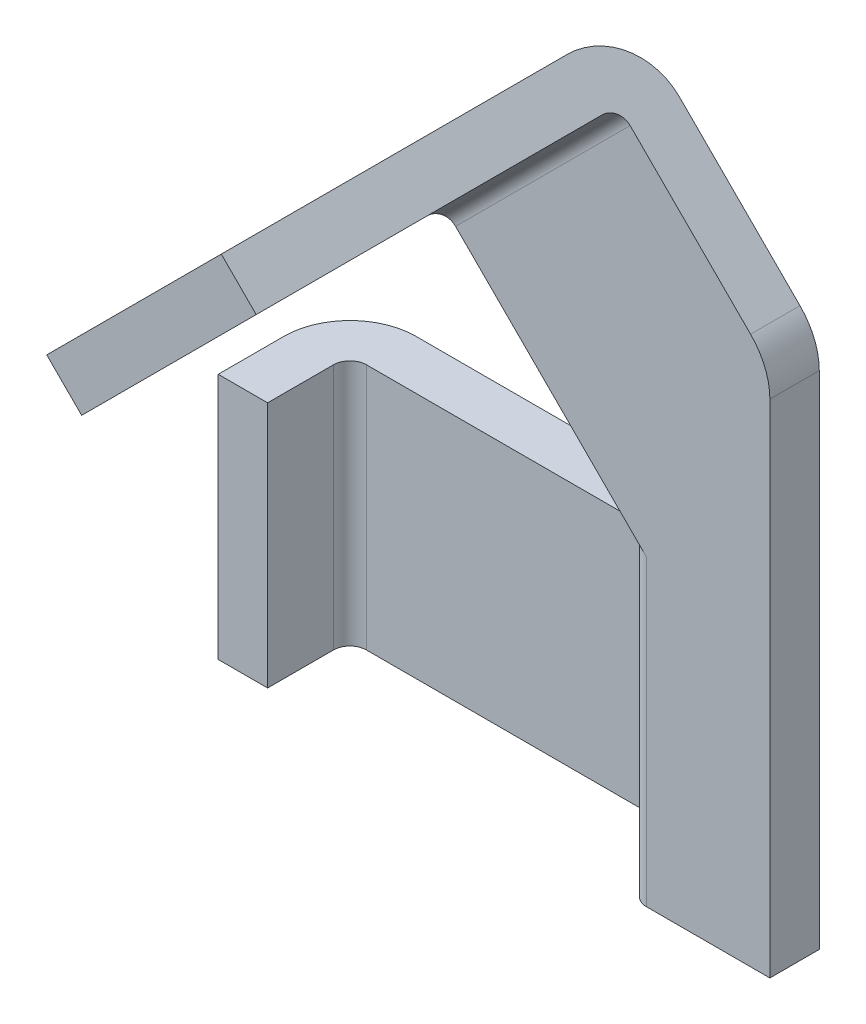
ISO-10303-21;
HEADER;
FILE_DESCRIPTION(('STEP AP214'),'2;1');
FILE_NAME('part.step','',(''),(''),'','','');
FILE_SCHEMA(('AUTOMOTIVE_DESIGN { 1 0 10303 214 1 1 1 1 }'));
ENDSEC;
DATA;
#1=APPLICATION_CONTEXT('core data for automotive mechanical design processes');
#2=APPLICATION_PROTOCOL_DEFINITION('international standard','automotive_design',2000,#1);
#3=PRODUCT_CONTEXT('',#1,'mechanical');
#4=PRODUCT('Part','Part','',(#3));
#5=PRODUCT_RELATED_PRODUCT_CATEGORY('part','',(#4));
#6=PRODUCT_DEFINITION_FORMATION('','',#4);
#7=PRODUCT_DEFINITION_CONTEXT('part definition',#1,'design');
#8=PRODUCT_DEFINITION('design','',#6,#7);
#9=PRODUCT_DEFINITION_SHAPE('','',#8);
#10=(LENGTH_UNIT() NAMED_UNIT(*) SI_UNIT(.MILLI.,.METRE.));
#11=(NAMED_UNIT(*) PLANE_ANGLE_UNIT() SI_UNIT($,.RADIAN.));
#12=(NAMED_UNIT(*) SI_UNIT($,.STERADIAN.) SOLID_ANGLE_UNIT());
#13=UNCERTAINTY_MEASURE_WITH_UNIT(LENGTH_MEASURE(1.E-05),#10,'distance_accuracy_value','');
#14=(GEOMETRIC_REPRESENTATION_CONTEXT(3) GLOBAL_UNCERTAINTY_ASSIGNED_CONTEXT((#13)) GLOBAL_UNIT_ASSIGNED_CONTEXT((#10,
#11,#12)) REPRESENTATION_CONTEXT('',''));
#15=CARTESIAN_POINT('',(0.,0.,0.));
#16=DIRECTION('',(0.,0.,1.));
#17=DIRECTION('',(1.,0.,0.));
#18=AXIS2_PLACEMENT_3D('',#15,#16,#17);
#19=CARTESIAN_POINT('',(-18.7,12.,2.));
#20=DIRECTION('',(-1.,0.,0.));
#21=DIRECTION('',(0.,0.,1.));
#22=AXIS2_PLACEMENT_3D('',#19,#20,#21);
#23=PLANE('',#22);
#24=DIRECTION('',(0.,1.,0.));
#25=VECTOR('',#24,1.);
#26=CARTESIAN_POINT('',(-18.70000000001,12.00000000001,2.50000000001));
#27=LINE('',#26,#25);
#28=CARTESIAN_POINT('',(-18.7,12.,2.5));
#29=VERTEX_POINT('',#28);
#30=CARTESIAN_POINT('',(-18.7,13.5,2.5));
#31=VERTEX_POINT('',#30);
#32=EDGE_CURVE('E11',#29,#31,#27,.T.);
#33=ORIENTED_EDGE('',*,*,#32,.T.);
#34=DIRECTION('',(0.,0.,1.));
#35=VECTOR('',#34,1.);
#36=CARTESIAN_POINT('',(-18.70000000001,13.50000000001,2.10000000001));
#37=LINE('',#36,#35);
#38=CARTESIAN_POINT('',(-18.7,13.5,2.1));
#39=VERTEX_POINT('',#38);
#40=EDGE_CURVE('E41',#39,#31,#37,.T.);
#41=ORIENTED_EDGE('',*,*,#40,.F.);
#42=DIRECTION('',(0.,1.,0.));
#43=VECTOR('',#42,1.);
#44=CARTESIAN_POINT('',(-18.70000000001,12.00000000001,2.10000000001));
#45=LINE('',#44,#43);
#46=CARTESIAN_POINT('',(-18.7,12.,2.1));
#47=VERTEX_POINT('',#46);
#48=EDGE_CURVE('E419',#47,#39,#45,.T.);
#49=ORIENTED_EDGE('',*,*,#48,.F.);
#50=DIRECTION('',(0.,0.,-1.));
#51=VECTOR('',#50,1.);
#52=CARTESIAN_POINT('',(-18.70000000001,12.00000000001,2.50000000001));
#53=LINE('',#52,#51);
#54=EDGE_CURVE('E473',#29,#47,#53,.T.);
#55=ORIENTED_EDGE('',*,*,#54,.F.);
#56=EDGE_LOOP('',(#33,#41,#49,#55));
#57=FACE_BOUND('',#56,.T.);
#58=ADVANCED_FACE('F17',(#57),#23,.T.);
#59=CARTESIAN_POINT('',(-15.35,12.,2.2));
#60=DIRECTION('',(0.,1.,0.));
#61=DIRECTION('',(1.,0.,0.));
#62=AXIS2_PLACEMENT_3D('',#59,#60,#61);
#63=PLANE('',#62);
#64=DIRECTION('',(1.,0.,0.));
#65=VECTOR('',#64,1.);
#66=CARTESIAN_POINT('',(-18.30000000001,12.00000000001,1.70000000001));
#67=LINE('',#66,#65);
#68=CARTESIAN_POINT('',(-18.3,12.,1.7));
#69=VERTEX_POINT('',#68);
#70=CARTESIAN_POINT('',(-16.3,12.,1.7));
#71=VERTEX_POINT('',#70);
#72=EDGE_CURVE('E28',#69,#71,#67,.T.);
#73=ORIENTED_EDGE('',*,*,#72,.T.);
#74=CARTESIAN_POINT('',(-16.30000000001,12.00000000001,2.10000000001));
#75=DIRECTION('',(0.,-1.,0.));
#76=DIRECTION('',(0.,0.,-1.));
#77=AXIS2_PLACEMENT_3D('',#74,#75,#76);
#78=CIRCLE('',#77,0.40000000001);
#79=CARTESIAN_POINT('',(-15.9,12.,2.1));
#80=VERTEX_POINT('',#79);
#81=EDGE_CURVE('E396',#71,#80,#78,.T.);
#82=ORIENTED_EDGE('',*,*,#81,.T.);
#83=CARTESIAN_POINT('',(-15.80000000001,12.00000000001,2.10000000001));
#84=DIRECTION('',(0.,1.,0.));
#85=DIRECTION('',(-1.,0.,-1.00550670610159E-10));
#86=AXIS2_PLACEMENT_3D('',#83,#84,#85);
#87=CIRCLE('',#86,0.10000000001);
#88=CARTESIAN_POINT('',(-15.8,12.,2.2));
#89=VERTEX_POINT('',#88);
#90=EDGE_CURVE('E517',#80,#89,#87,.T.);
#91=ORIENTED_EDGE('',*,*,#90,.T.);
#92=DIRECTION('',(1.,0.,0.));
#93=VECTOR('',#92,1.);
#94=CARTESIAN_POINT('',(-15.80000000001,12.00000000001,2.20000000001));
#95=LINE('',#94,#93);
#96=CARTESIAN_POINT('',(-15.35,12.,2.2));
#97=VERTEX_POINT('',#96);
#98=EDGE_CURVE('E256',#89,#97,#95,.T.);
#99=ORIENTED_EDGE('',*,*,#98,.T.);
#100=DIRECTION('',(0.,0.,1.));
#101=VECTOR('',#100,1.);
#102=CARTESIAN_POINT('',(-15.35000000001,12.00000000001,2.20000000001));
#103=LINE('',#102,#101);
#104=CARTESIAN_POINT('',(-15.35,12.,2.5));
#105=VERTEX_POINT('',#104);
#106=EDGE_CURVE('E214',#97,#105,#103,.T.);
#107=ORIENTED_EDGE('',*,*,#106,.T.);
#108=DIRECTION('',(-1.,0.,0.));
#109=VECTOR('',#108,1.);
#110=CARTESIAN_POINT('',(-15.35000000001,12.00000000001,2.50000000001));
#111=LINE('',#110,#109);
#112=CARTESIAN_POINT('',(-16.1,12.,2.5));
#113=VERTEX_POINT('',#112);
#114=EDGE_CURVE('E207',#105,#113,#111,.T.);
#115=ORIENTED_EDGE('',*,*,#114,.T.);
#116=CARTESIAN_POINT('',(-16.10000000001,12.00000000001,2.40000000001));
#117=DIRECTION('',(0.,-1.,0.));
#118=DIRECTION('',(0.,0.,1.));
#119=AXIS2_PLACEMENT_3D('',#116,#117,#118);
#120=CIRCLE('',#119,0.10000000001);
#121=CARTESIAN_POINT('',(-16.2,12.,2.4));
#122=VERTEX_POINT('',#121);
#123=EDGE_CURVE('E196',#113,#122,#120,.T.);
#124=ORIENTED_EDGE('',*,*,#123,.T.);
#125=DIRECTION('',(3.34517571214782E-11,0.,-1.));
#126=VECTOR('',#125,1.);
#127=CARTESIAN_POINT('',(-16.20000000001,12.00000000001,2.40000000001));
#128=LINE('',#127,#126);
#129=CARTESIAN_POINT('',(-16.2,12.,2.1));
#130=VERTEX_POINT('',#129);
#131=EDGE_CURVE('E208',#122,#130,#128,.T.);
#132=ORIENTED_EDGE('',*,*,#131,.T.);
#133=CARTESIAN_POINT('',(-16.30000000001,12.00000000001,2.10000000001));
#134=DIRECTION('',(0.,1.,0.));
#135=DIRECTION('',(1.,0.,-1.07536193880401E-10));
#136=AXIS2_PLACEMENT_3D('',#133,#134,#135);
#137=CIRCLE('',#136,0.10000000001);
#138=CARTESIAN_POINT('',(-16.3,12.,2.));
#139=VERTEX_POINT('',#138);
#140=EDGE_CURVE('E437',#130,#139,#137,.T.);
#141=ORIENTED_EDGE('',*,*,#140,.T.);
#142=DIRECTION('',(1.,0.,0.));
#143=VECTOR('',#142,1.);
#144=CARTESIAN_POINT('',(-18.30000000001,12.00000000001,2.00000000001));
#145=LINE('',#144,#143);
#146=CARTESIAN_POINT('',(-18.3,12.,2.));
#147=VERTEX_POINT('',#146);
#148=EDGE_CURVE('E283',#147,#139,#145,.T.);
#149=ORIENTED_EDGE('',*,*,#148,.F.);
#150=CARTESIAN_POINT('',(-18.30000000001,12.00000000001,2.10000000001));
#151=DIRECTION('',(0.,1.,0.));
#152=DIRECTION('',(0.,0.,-1.));
#153=AXIS2_PLACEMENT_3D('',#150,#151,#152);
#154=CIRCLE('',#153,0.10000000001);
#155=CARTESIAN_POINT('',(-18.4,12.,2.1));
#156=VERTEX_POINT('',#155);
#157=EDGE_CURVE('E472',#147,#156,#154,.T.);
#158=ORIENTED_EDGE('',*,*,#157,.T.);
#159=DIRECTION('',(-2.5088817841324E-11,0.,-1.));
#160=VECTOR('',#159,1.);
#161=CARTESIAN_POINT('',(-18.40000000001,12.00000000001,2.50000000001));
#162=LINE('',#161,#160);
#163=CARTESIAN_POINT('',(-18.4,12.,2.5));
#164=VERTEX_POINT('',#163);
#165=EDGE_CURVE('E267',#164,#156,#162,.T.);
#166=ORIENTED_EDGE('',*,*,#165,.F.);
#167=DIRECTION('',(-1.,0.,0.));
#168=VECTOR('',#167,1.);
#169=CARTESIAN_POINT('',(-18.40000000001,12.00000000001,2.50000000001));
#170=LINE('',#169,#168);
#171=EDGE_CURVE('E468',#164,#29,#170,.T.);
#172=ORIENTED_EDGE('',*,*,#171,.T.);
#173=ORIENTED_EDGE('',*,*,#54,.T.);
#174=CARTESIAN_POINT('',(-18.30000000001,12.00000000001,2.10000000001));
#175=DIRECTION('',(0.,-1.,0.));
#176=DIRECTION('',(-1.,0.,0.));
#177=AXIS2_PLACEMENT_3D('',#174,#175,#176);
#178=CIRCLE('',#177,0.40000000001);
#179=EDGE_CURVE('E422',#47,#69,#178,.T.);
#180=ORIENTED_EDGE('',*,*,#179,.T.);
#181=EDGE_LOOP('',(#73,#82,#91,#99,#107,#115,#124,#132,#141,#149,#158,#166,#172,#173,#180));
#182=FACE_BOUND('',#181,.T.);
#183=ADVANCED_FACE('F212',(#182),#63,.F.);
#184=CARTESIAN_POINT('',(-18.3,12.,2.1));
#185=DIRECTION('',(0.,1.,0.));
#186=DIRECTION('',(0.,0.,-1.));
#187=AXIS2_PLACEMENT_3D('',#184,#185,#186);
#188=CYLINDRICAL_SURFACE('',#187,0.4);
#189=ORIENTED_EDGE('',*,*,#48,.T.);
#190=CARTESIAN_POINT('',(-18.30000000001,13.50000000001,2.10000000001));
#191=DIRECTION('',(0.,1.,0.));
#192=DIRECTION('',(0.,0.,-1.));
#193=AXIS2_PLACEMENT_3D('',#190,#191,#192);
#194=CIRCLE('',#193,0.40000000001);
#195=CARTESIAN_POINT('',(-18.3,13.5,1.7));
#196=VERTEX_POINT('',#195);
#197=EDGE_CURVE('E399',#196,#39,#194,.T.);
#198=ORIENTED_EDGE('',*,*,#197,.F.);
#199=DIRECTION('',(0.,-1.,0.));
#200=VECTOR('',#199,1.);
#201=CARTESIAN_POINT('',(-18.30000000001,13.50000000001,1.70000000001));
#202=LINE('',#201,#200);
#203=EDGE_CURVE('E286',#196,#69,#202,.T.);
#204=ORIENTED_EDGE('',*,*,#203,.T.);
#205=ORIENTED_EDGE('',*,*,#179,.F.);
#206=EDGE_LOOP('',(#189,#198,#204,#205));
#207=FACE_BOUND('',#206,.T.);
#208=ADVANCED_FACE('F310',(#207),#188,.T.);
#209=CARTESIAN_POINT('',(-16.2,12.,1.7));
#210=DIRECTION('',(0.,0.,-1.));
#211=DIRECTION('',(0.,-1.,0.));
#212=AXIS2_PLACEMENT_3D('',#209,#210,#211);
#213=PLANE('',#212);
#214=DIRECTION('',(0.,1.,0.));
#215=VECTOR('',#214,1.);
#216=CARTESIAN_POINT('',(-16.30000000001,12.00000000001,1.70000000001));
#217=LINE('',#216,#215);
#218=CARTESIAN_POINT('',(-16.3,13.5,1.7));
#219=VERTEX_POINT('',#218);
#220=EDGE_CURVE('E389',#71,#219,#217,.T.);
#221=ORIENTED_EDGE('',*,*,#220,.F.);
#222=ORIENTED_EDGE('',*,*,#72,.F.);
#223=ORIENTED_EDGE('',*,*,#203,.F.);
#224=DIRECTION('',(-1.,0.,0.));
#225=VECTOR('',#224,1.);
#226=CARTESIAN_POINT('',(-16.30000000001,13.50000000001,1.70000000001));
#227=LINE('',#226,#225);
#228=EDGE_CURVE('E403',#219,#196,#227,.T.);
#229=ORIENTED_EDGE('',*,*,#228,.F.);
#230=EDGE_LOOP('',(#221,#222,#223,#229));
#231=FACE_BOUND('',#230,.T.);
#232=ADVANCED_FACE('F356',(#231),#213,.T.);
#233=CARTESIAN_POINT('',(-16.2,13.5,1.7));
#234=DIRECTION('',(0.,-1.,0.));
#235=DIRECTION('',(0.,0.,-1.));
#236=AXIS2_PLACEMENT_3D('',#233,#234,#235);
#237=PLANE('',#236);
#238=ORIENTED_EDGE('',*,*,#40,.T.);
#239=DIRECTION('',(1.,0.,0.));
#240=VECTOR('',#239,1.);
#241=CARTESIAN_POINT('',(-18.70000000001,13.50000000001,2.50000000001));
#242=LINE('',#241,#240);
#243=CARTESIAN_POINT('',(-18.4,13.5,2.5));
#244=VERTEX_POINT('',#243);
#245=EDGE_CURVE('E287',#31,#244,#242,.T.);
#246=ORIENTED_EDGE('',*,*,#245,.T.);
#247=DIRECTION('',(2.5088817841324E-11,0.,1.));
#248=VECTOR('',#247,1.);
#249=CARTESIAN_POINT('',(-18.40000000001,13.50000000001,2.10000000001));
#250=LINE('',#249,#248);
#251=CARTESIAN_POINT('',(-18.4,13.5,2.1));
#252=VERTEX_POINT('',#251);
#253=EDGE_CURVE('E262',#252,#244,#250,.T.);
#254=ORIENTED_EDGE('',*,*,#253,.F.);
#255=CARTESIAN_POINT('',(-18.30000000001,13.50000000001,2.10000000001));
#256=DIRECTION('',(0.,-1.,0.));
#257=DIRECTION('',(-1.,0.,-1.07798206514187E-10));
#258=AXIS2_PLACEMENT_3D('',#255,#256,#257);
#259=CIRCLE('',#258,0.10000000001);
#260=CARTESIAN_POINT('',(-18.3,13.5,2.));
#261=VERTEX_POINT('',#260);
#262=EDGE_CURVE('E278',#252,#261,#259,.T.);
#263=ORIENTED_EDGE('',*,*,#262,.T.);
#264=DIRECTION('',(-1.,0.,0.));
#265=VECTOR('',#264,1.);
#266=CARTESIAN_POINT('',(-16.30000000001,13.50000000001,2.00000000001));
#267=LINE('',#266,#265);
#268=CARTESIAN_POINT('',(-16.3,13.5,2.));
#269=VERTEX_POINT('',#268);
#270=EDGE_CURVE('E479',#269,#261,#267,.T.);
#271=ORIENTED_EDGE('',*,*,#270,.F.);
#272=CARTESIAN_POINT('',(-16.30000000001,13.50000000001,2.10000000001));
#273=DIRECTION('',(0.,-1.,0.));
#274=DIRECTION('',(0.,0.,-1.));
#275=AXIS2_PLACEMENT_3D('',#272,#273,#274);
#276=CIRCLE('',#275,0.10000000001);
#277=CARTESIAN_POINT('',(-16.2,13.5,2.099999999999));
#278=VERTEX_POINT('',#277);
#279=EDGE_CURVE('E274',#269,#278,#276,.T.);
#280=ORIENTED_EDGE('',*,*,#279,.T.);
#281=DIRECTION('',(-1.00319744220759E-10,0.,1.));
#282=VECTOR('',#281,1.);
#283=CARTESIAN_POINT('',(-16.20000000001,13.50000000001,2.10000000001));
#284=LINE('',#283,#282);
#285=CARTESIAN_POINT('',(-16.2,13.5,2.2));
#286=VERTEX_POINT('',#285);
#287=EDGE_CURVE('E279',#278,#286,#284,.T.);
#288=ORIENTED_EDGE('',*,*,#287,.T.);
#289=DIRECTION('',(1.,0.,0.));
#290=VECTOR('',#289,1.);
#291=CARTESIAN_POINT('',(-16.20000000001,13.50000000001,2.20000000001));
#292=LINE('',#291,#290);
#293=CARTESIAN_POINT('',(-15.8,13.5,2.2));
#294=VERTEX_POINT('',#293);
#295=EDGE_CURVE('E414',#286,#294,#292,.T.);
#296=ORIENTED_EDGE('',*,*,#295,.T.);
#297=CARTESIAN_POINT('',(-15.80000000001,13.50000000001,2.10000000001));
#298=DIRECTION('',(0.,-1.,0.));
#299=DIRECTION('',(0.,0.,1.));
#300=AXIS2_PLACEMENT_3D('',#297,#298,#299);
#301=CIRCLE('',#300,0.10000000001);
#302=CARTESIAN_POINT('',(-15.9,13.5,2.1));
#303=VERTEX_POINT('',#302);
#304=EDGE_CURVE('E408',#294,#303,#301,.T.);
#305=ORIENTED_EDGE('',*,*,#304,.T.);
#306=CARTESIAN_POINT('',(-16.30000000001,13.50000000001,2.10000000001));
#307=DIRECTION('',(0.,1.,0.));
#308=DIRECTION('',(1.,0.,-2.51221245320808E-11));
#309=AXIS2_PLACEMENT_3D('',#306,#307,#308);
#310=CIRCLE('',#309,0.40000000001);
#311=EDGE_CURVE('E393',#303,#219,#310,.T.);
#312=ORIENTED_EDGE('',*,*,#311,.T.);
#313=ORIENTED_EDGE('',*,*,#228,.T.);
#314=ORIENTED_EDGE('',*,*,#197,.T.);
#315=EDGE_LOOP('',(#238,#246,#254,#263,#271,#280,#288,#296,#305,#312,#313,#314));
#316=FACE_BOUND('',#315,.T.);
#317=ADVANCED_FACE('F353',(#316),#237,.F.);
#318=CARTESIAN_POINT('',(-16.3,12.,2.1));
#319=DIRECTION('',(0.,-1.,0.));
#320=DIRECTION('',(-1.,0.,0.));
#321=AXIS2_PLACEMENT_3D('',#318,#319,#320);
#322=CYLINDRICAL_SURFACE('',#321,0.4);
#323=ORIENTED_EDGE('',*,*,#220,.T.);
#324=ORIENTED_EDGE('',*,*,#311,.F.);
#325=DIRECTION('',(0.,1.,0.));
#326=VECTOR('',#325,1.);
#327=CARTESIAN_POINT('',(-15.90000000001,12.00000000001,2.10000000001));
#328=LINE('',#327,#326);
#329=EDGE_CURVE('E272',#80,#303,#328,.T.);
#330=ORIENTED_EDGE('',*,*,#329,.F.);
#331=ORIENTED_EDGE('',*,*,#81,.F.);
#332=EDGE_LOOP('',(#323,#324,#330,#331));
#333=FACE_BOUND('',#332,.T.);
#334=ADVANCED_FACE('F351',(#333),#322,.T.);
#335=CARTESIAN_POINT('',(-15.8,13.5,2.1));
#336=DIRECTION('',(0.,-1.,0.));
#337=DIRECTION('',(-1.,0.,0.));
#338=AXIS2_PLACEMENT_3D('',#335,#336,#337);
#339=CYLINDRICAL_SURFACE('',#338,0.1);
#340=ORIENTED_EDGE('',*,*,#329,.T.);
#341=ORIENTED_EDGE('',*,*,#304,.F.);
#342=DIRECTION('',(0.,-1.,0.));
#343=VECTOR('',#342,1.);
#344=CARTESIAN_POINT('',(-15.80000000001,13.50000000001,2.20000000001));
#345=LINE('',#344,#343);
#346=EDGE_CURVE('E268',#294,#89,#345,.T.);
#347=ORIENTED_EDGE('',*,*,#346,.T.);
#348=ORIENTED_EDGE('',*,*,#90,.F.);
#349=EDGE_LOOP('',(#340,#341,#347,#348));
#350=FACE_BOUND('',#349,.T.);
#351=ADVANCED_FACE('F348',(#350),#339,.F.);
#352=CARTESIAN_POINT('',(-16.26923881554,16.12923881554,2.2));
#353=DIRECTION('',(0.,0.,1.));
#354=DIRECTION('',(1.,0.,0.));
#355=AXIS2_PLACEMENT_3D('',#352,#353,#354);
#356=PLANE('',#355);
#357=DIRECTION('',(0.707106781186597,-0.707106781186498,0.));
#358=VECTOR('',#357,1.);
#359=CARTESIAN_POINT('',(-16.19852813743,16.05852813743,2.20000000001));
#360=LINE('',#359,#358);
#361=CARTESIAN_POINT('',(-16.19852813742,16.05852813742,2.2));
#362=VERTEX_POINT('',#361);
#363=CARTESIAN_POINT('',(-15.46715728752,15.32715728752,2.2));
#364=VERTEX_POINT('',#363);
#365=EDGE_CURVE('E273',#362,#364,#360,.T.);
#366=ORIENTED_EDGE('',*,*,#365,.T.);
#367=CARTESIAN_POINT('',(-15.75000000001,15.04431457506,2.20000000001));
#368=DIRECTION('',(0.,0.,-1.));
#369=DIRECTION('',(0.707106781190198,0.707106781182898,0.));
#370=AXIS2_PLACEMENT_3D('',#367,#368,#369);
#371=CIRCLE('',#370,0.400000000014142);
#372=CARTESIAN_POINT('',(-15.35,15.04431457505,2.2));
#373=VERTEX_POINT('',#372);
#374=EDGE_CURVE('E487',#364,#373,#371,.T.);
#375=ORIENTED_EDGE('',*,*,#374,.T.);
#376=DIRECTION('',(0.,1.,0.));
#377=VECTOR('',#376,1.);
#378=CARTESIAN_POINT('',(-15.35000000001,12.00000000001,2.20000000001));
#379=LINE('',#378,#377);
#380=EDGE_CURVE('E523',#97,#373,#379,.T.);
#381=ORIENTED_EDGE('',*,*,#380,.F.);
#382=ORIENTED_EDGE('',*,*,#98,.F.);
#383=ORIENTED_EDGE('',*,*,#346,.F.);
#384=ORIENTED_EDGE('',*,*,#295,.F.);
#385=DIRECTION('',(0.,-1.,0.));
#386=VECTOR('',#385,1.);
#387=CARTESIAN_POINT('',(-16.20000000001,13.94000000001,2.20000000001));
#388=LINE('',#387,#386);
#389=CARTESIAN_POINT('',(-16.2,13.94,2.2));
#390=VERTEX_POINT('',#389);
#391=EDGE_CURVE('E434',#390,#286,#388,.T.);
#392=ORIENTED_EDGE('',*,*,#391,.F.);
#393=DIRECTION('',(-0.707106781186498,0.707106781186597,0.));
#394=VECTOR('',#393,1.);
#395=CARTESIAN_POINT('',(-16.20000000001,13.94000000001,2.20000000001));
#396=LINE('',#395,#394);
#397=CARTESIAN_POINT('',(-17.25852813742,14.99852813742,2.2));
#398=VERTEX_POINT('',#397);
#399=EDGE_CURVE('E491',#390,#398,#396,.T.);
#400=ORIENTED_EDGE('',*,*,#399,.T.);
#401=DIRECTION('',(0.707106781186548,0.707106781186548,0.));
#402=VECTOR('',#401,1.);
#403=CARTESIAN_POINT('',(-17.25852813743,14.99852813743,2.20000000001));
#404=LINE('',#403,#402);
#405=EDGE_CURVE('E488',#398,#362,#404,.T.);
#406=ORIENTED_EDGE('',*,*,#405,.T.);
#407=EDGE_LOOP('',(#366,#375,#381,#382,#383,#384,#392,#400,#406));
#408=FACE_BOUND('',#407,.T.);
#409=ADVANCED_FACE('F334',(#408),#356,.F.);
#410=CARTESIAN_POINT('',(-16.19852813742,16.05852813742,2.6));
#411=DIRECTION('',(0.707106781186548,0.707106781186548,0.));
#412=DIRECTION('',(0.707106781186548,-0.707106781186548,0.));
#413=AXIS2_PLACEMENT_3D('',#410,#411,#412);
#414=CYLINDRICAL_SURFACE('',#413,0.4);
#415=ORIENTED_EDGE('',*,*,#405,.F.);
#416=CARTESIAN_POINT('',(-17.25852813743,14.99852813743,2.60000000001));
#417=DIRECTION('',(-0.707106781186548,-0.707106781186548,0.));
#418=DIRECTION('',(-0.707106781186548,0.707106781186548,-3.63564713176053E-11));
#419=AXIS2_PLACEMENT_3D('',#416,#417,#418);
#420=CIRCLE('',#419,0.400000000014142);
#421=CARTESIAN_POINT('',(-17.5413708499,15.2813708499,2.599999999998));
#422=VERTEX_POINT('',#421);
#423=EDGE_CURVE('E427',#422,#398,#420,.T.);
#424=ORIENTED_EDGE('',*,*,#423,.F.);
#425=DIRECTION('',(0.707106781186548,0.707106781186548,0.));
#426=VECTOR('',#425,1.);
#427=CARTESIAN_POINT('',(-17.54137084991,15.28137084991,2.600000000008));
#428=LINE('',#427,#426);
#429=CARTESIAN_POINT('',(-16.4813708499,16.3413708499,2.599999999995));
#430=VERTEX_POINT('',#429);
#431=EDGE_CURVE('E492',#422,#430,#428,.T.);
#432=ORIENTED_EDGE('',*,*,#431,.T.);
#433=CARTESIAN_POINT('',(-16.19852813743,16.05852813743,2.60000000001));
#434=DIRECTION('',(0.707106781186548,0.707106781186548,0.));
#435=DIRECTION('',(0.,0.,-1.));
#436=AXIS2_PLACEMENT_3D('',#433,#434,#435);
#437=CIRCLE('',#436,0.40000000001);
#438=EDGE_CURVE('E438',#362,#430,#437,.T.);
#439=ORIENTED_EDGE('',*,*,#438,.F.);
#440=EDGE_LOOP('',(#415,#424,#432,#439));
#441=FACE_BOUND('',#440,.T.);
#442=ADVANCED_FACE('F331',(#441),#414,.T.);
#443=CARTESIAN_POINT('',(-15.35,15.21,2.2));
#444=DIRECTION('',(-0.707106781186548,-0.707106781186548,0.));
#445=DIRECTION('',(-0.707106781186548,0.707106781186548,0.));
#446=AXIS2_PLACEMENT_3D('',#443,#444,#445);
#447=PLANE('',#446);
#448=DIRECTION('',(4.80419897233923E-12,-4.8211166565239E-12,1.));
#449=VECTOR('',#448,1.);
#450=CARTESIAN_POINT('',(-16.48137084991,16.34137084991,2.600000000008));
#451=LINE('',#450,#449);
#452=CARTESIAN_POINT('',(-16.4813708499,16.3413708499,4.7));
#453=VERTEX_POINT('',#452);
#454=EDGE_CURVE('E493',#430,#453,#451,.T.);
#455=ORIENTED_EDGE('',*,*,#454,.T.);
#456=DIRECTION('',(-0.707106781186597,0.707106781186498,0.));
#457=VECTOR('',#456,1.);
#458=CARTESIAN_POINT('',(-16.26923881555,16.12923881555,4.70000000001));
#459=LINE('',#458,#457);
#460=CARTESIAN_POINT('',(-16.26923881554,16.12923881554,4.7));
#461=VERTEX_POINT('',#460);
#462=EDGE_CURVE('E418',#461,#453,#459,.T.);
#463=ORIENTED_EDGE('',*,*,#462,.F.);
#464=DIRECTION('',(4.82450019336772E-12,-4.81096604601997E-12,-1.));
#465=VECTOR('',#464,1.);
#466=CARTESIAN_POINT('',(-16.26923881555,16.12923881555,4.70000000001));
#467=LINE('',#466,#465);
#468=CARTESIAN_POINT('',(-16.26923881554,16.12923881554,2.600000000001));
#469=VERTEX_POINT('',#468);
#470=EDGE_CURVE('E477',#461,#469,#467,.T.);
#471=ORIENTED_EDGE('',*,*,#470,.T.);
#472=CARTESIAN_POINT('',(-16.19852813743,16.05852813743,2.60000000001));
#473=DIRECTION('',(-0.707106781186548,-0.707106781186548,0.));
#474=DIRECTION('',(-0.707106781186548,0.707106781186548,1.36921576887569E-10));
#475=AXIS2_PLACEMENT_3D('',#472,#473,#474);
#476=CIRCLE('',#475,0.100000000014142);
#477=CARTESIAN_POINT('',(-16.19852813742,16.05852813742,2.5));
#478=VERTEX_POINT('',#477);
#479=EDGE_CURVE('E441',#469,#478,#476,.T.);
#480=ORIENTED_EDGE('',*,*,#479,.T.);
#481=DIRECTION('',(-0.707106781186597,0.707106781186498,0.));
#482=VECTOR('',#481,1.);
#483=CARTESIAN_POINT('',(-15.46715728753,15.32715728753,2.50000000001));
#484=LINE('',#483,#482);
#485=CARTESIAN_POINT('',(-15.46715728752,15.32715728752,2.5));
#486=VERTEX_POINT('',#485);
#487=EDGE_CURVE('E242',#486,#478,#484,.T.);
#488=ORIENTED_EDGE('',*,*,#487,.F.);
#489=DIRECTION('',(0.,0.,1.));
#490=VECTOR('',#489,1.);
#491=CARTESIAN_POINT('',(-15.46715728753,15.32715728753,2.20000000001));
#492=LINE('',#491,#490);
#493=EDGE_CURVE('E500',#364,#486,#492,.T.);
#494=ORIENTED_EDGE('',*,*,#493,.F.);
#495=ORIENTED_EDGE('',*,*,#365,.F.);
#496=ORIENTED_EDGE('',*,*,#438,.T.);
#497=EDGE_LOOP('',(#455,#463,#471,#480,#488,#494,#495,#496));
#498=FACE_BOUND('',#497,.T.);
#499=ADVANCED_FACE('F314',(#498),#447,.F.);
#500=CARTESIAN_POINT('',(-15.75,15.04431457505,2.2));
#501=DIRECTION('',(0.,0.,-1.));
#502=DIRECTION('',(0.,-1.,0.));
#503=AXIS2_PLACEMENT_3D('',#500,#501,#502);
#504=CYLINDRICAL_SURFACE('',#503,0.4);
#505=DIRECTION('',(0.,0.,-1.));
#506=VECTOR('',#505,1.);
#507=CARTESIAN_POINT('',(-15.35000000001,15.04431457506,2.50000000001));
#508=LINE('',#507,#506);
#509=CARTESIAN_POINT('',(-15.35,15.04431457505,2.5));
#510=VERTEX_POINT('',#509);
#511=EDGE_CURVE('E442',#510,#373,#508,.T.);
#512=ORIENTED_EDGE('',*,*,#511,.T.);
#513=ORIENTED_EDGE('',*,*,#374,.F.);
#514=ORIENTED_EDGE('',*,*,#493,.T.);
#515=CARTESIAN_POINT('',(-15.75000000001,15.04431457506,2.50000000001));
#516=DIRECTION('',(0.,0.,1.));
#517=DIRECTION('',(1.,0.,0.));
#518=AXIS2_PLACEMENT_3D('',#515,#516,#517);
#519=CIRCLE('',#518,0.40000000001);
#520=EDGE_CURVE('E249',#510,#486,#519,.T.);
#521=ORIENTED_EDGE('',*,*,#520,.F.);
#522=EDGE_LOOP('',(#512,#513,#514,#521));
#523=FACE_BOUND('',#522,.T.);
#524=ADVANCED_FACE('F311',(#523),#504,.T.);
#525=CARTESIAN_POINT('',(-16.26923881554,16.12923881554,2.5));
#526=DIRECTION('',(0.,0.,1.));
#527=DIRECTION('',(1.,0.,0.));
#528=AXIS2_PLACEMENT_3D('',#525,#526,#527);
#529=PLANE('',#528);
#530=ORIENTED_EDGE('',*,*,#114,.F.);
#531=DIRECTION('',(0.,-1.,0.));
#532=VECTOR('',#531,1.);
#533=CARTESIAN_POINT('',(-15.35000000001,15.04431457506,2.50000000001));
#534=LINE('',#533,#532);
#535=EDGE_CURVE('E445',#510,#105,#534,.T.);
#536=ORIENTED_EDGE('',*,*,#535,.F.);
#537=ORIENTED_EDGE('',*,*,#520,.T.);
#538=ORIENTED_EDGE('',*,*,#487,.T.);
#539=DIRECTION('',(-0.707106781186548,-0.707106781186548,0.));
#540=VECTOR('',#539,1.);
#541=CARTESIAN_POINT('',(-16.19852813743,16.05852813743,2.50000000001));
#542=LINE('',#541,#540);
#543=CARTESIAN_POINT('',(-17.25852813742,14.99852813742,2.5));
#544=VERTEX_POINT('',#543);
#545=EDGE_CURVE('E239',#478,#544,#542,.T.);
#546=ORIENTED_EDGE('',*,*,#545,.T.);
#547=DIRECTION('',(0.707106781186498,-0.707106781186597,0.));
#548=VECTOR('',#547,1.);
#549=CARTESIAN_POINT('',(-17.25852813743,14.99852813743,2.50000000001));
#550=LINE('',#549,#548);
#551=CARTESIAN_POINT('',(-16.1,13.84,2.5));
#552=VERTEX_POINT('',#551);
#553=EDGE_CURVE('E222',#544,#552,#550,.T.);
#554=ORIENTED_EDGE('',*,*,#553,.T.);
#555=DIRECTION('',(0.,1.,0.));
#556=VECTOR('',#555,1.);
#557=CARTESIAN_POINT('',(-16.10000000001,12.00000000001,2.50000000001));
#558=LINE('',#557,#556);
#559=EDGE_CURVE('E200',#113,#552,#558,.T.);
#560=ORIENTED_EDGE('',*,*,#559,.F.);
#561=EDGE_LOOP('',(#530,#536,#537,#538,#546,#554,#560));
#562=FACE_BOUND('',#561,.T.);
#563=ADVANCED_FACE('F220',(#562),#529,.T.);
#564=CARTESIAN_POINT('',(-16.1,12.,2.4));
#565=DIRECTION('',(0.,1.,0.));
#566=DIRECTION('',(0.,0.,-1.));
#567=AXIS2_PLACEMENT_3D('',#564,#565,#566);
#568=CYLINDRICAL_SURFACE('',#567,0.1);
#569=DIRECTION('',(0.,-1.,0.));
#570=VECTOR('',#569,1.);
#571=CARTESIAN_POINT('',(-16.20000000001,13.94000000001,2.40000000001));
#572=LINE('',#571,#570);
#573=CARTESIAN_POINT('',(-16.2,13.94,2.4));
#574=VERTEX_POINT('',#573);
#575=EDGE_CURVE('E203',#574,#122,#572,.T.);
#576=ORIENTED_EDGE('',*,*,#575,.T.);
#577=ORIENTED_EDGE('',*,*,#123,.F.);
#578=ORIENTED_EDGE('',*,*,#559,.T.);
#579=CARTESIAN_POINT('',(-16.20000000001,13.94000000001,2.40000000001));
#580=CARTESIAN_POINT('',(-16.20000000001,13.94000000001,2.42329429084867));
#581=CARTESIAN_POINT('',(-16.1892359075567,13.9292359075567,2.44513261353847));
#582=CARTESIAN_POINT('',(-16.1813553575315,13.9213553575315,2.46112077001045));
#583=CARTESIAN_POINT('',(-16.1670839080783,13.9070839080783,2.4741602944971));
#584=CARTESIAN_POINT('',(-16.1388029648975,13.8788029648975,2.50000000001));
#585=CARTESIAN_POINT('',(-16.10000000001,13.84000000001,2.50000000001));
#586=B_SPLINE_CURVE_WITH_KNOTS('',2,(#579,#580,#581,#582,#583,#584,#585),.UNSPECIFIED.,.F.,.F.,
(3,2,2,3),(0.,0.25,0.5,1.),.UNSPECIFIED.);
#587=EDGE_CURVE('E232',#574,#552,#586,.T.);
#588=ORIENTED_EDGE('',*,*,#587,.F.);
#589=EDGE_LOOP('',(#576,#577,#578,#588));
#590=FACE_BOUND('',#589,.T.);
#591=ADVANCED_FACE('F198',(#590),#568,.T.);
#592=CARTESIAN_POINT('',(-16.2,13.94,2.2));
#593=DIRECTION('',(0.707106781186548,0.707106781186548,0.));
#594=DIRECTION('',(0.,0.,-1.));
#595=AXIS2_PLACEMENT_3D('',#592,#593,#594);
#596=PLANE('',#595);
#597=ORIENTED_EDGE('',*,*,#399,.F.);
#598=DIRECTION('',(0.,-5.0159872113038E-11,1.));
#599=VECTOR('',#598,1.);
#600=CARTESIAN_POINT('',(-16.20000000001,13.94000000001,2.20000000001));
#601=LINE('',#600,#599);
#602=EDGE_CURVE('E225',#390,#574,#601,.T.);
#603=ORIENTED_EDGE('',*,*,#602,.T.);
#604=ORIENTED_EDGE('',*,*,#587,.T.);
#605=ORIENTED_EDGE('',*,*,#553,.F.);
#606=CARTESIAN_POINT('',(-17.25852813743,14.99852813743,2.60000000001));
#607=DIRECTION('',(0.707106781186548,0.707106781186548,0.));
#608=DIRECTION('',(0.,0.,-1.));
#609=AXIS2_PLACEMENT_3D('',#606,#607,#608);
#610=CIRCLE('',#609,0.10000000001);
#611=CARTESIAN_POINT('',(-17.32923881554,15.06923881554,2.600000000001));
#612=VERTEX_POINT('',#611);
#613=EDGE_CURVE('E504',#544,#612,#610,.T.);
#614=ORIENTED_EDGE('',*,*,#613,.T.);
#615=DIRECTION('',(-4.81604135127538E-12,4.81604135127538E-12,1.));
#616=VECTOR('',#615,1.);
#617=CARTESIAN_POINT('',(-17.32923881555,15.06923881555,2.600000000011));
#618=LINE('',#617,#616);
#619=CARTESIAN_POINT('',(-17.32923881554,15.06923881554,4.7));
#620=VERTEX_POINT('',#619);
#621=EDGE_CURVE('E508',#612,#620,#618,.T.);
#622=ORIENTED_EDGE('',*,*,#621,.T.);
#623=DIRECTION('',(0.707106781186298,-0.707106781186798,0.));
#624=VECTOR('',#623,1.);
#625=CARTESIAN_POINT('',(-17.54137084991,15.28137084991,4.70000000001));
#626=LINE('',#625,#624);
#627=CARTESIAN_POINT('',(-17.5413708499,15.2813708499,4.7));
#628=VERTEX_POINT('',#627);
#629=EDGE_CURVE('E424',#628,#620,#626,.T.);
#630=ORIENTED_EDGE('',*,*,#629,.F.);
#631=DIRECTION('',(-4.84987671963784E-12,4.77543890922529E-12,-1.));
#632=VECTOR('',#631,1.);
#633=CARTESIAN_POINT('',(-17.54137084991,15.28137084991,4.70000000001));
#634=LINE('',#633,#632);
#635=EDGE_CURVE('E524',#628,#422,#634,.T.);
#636=ORIENTED_EDGE('',*,*,#635,.T.);
#637=ORIENTED_EDGE('',*,*,#423,.T.);
#638=EDGE_LOOP('',(#597,#603,#604,#605,#614,#622,#630,#636,#637));
#639=FACE_BOUND('',#638,.T.);
#640=ADVANCED_FACE('F295',(#639),#596,.F.);
#641=CARTESIAN_POINT('',(-17.5413708499,15.2813708499,4.7));
#642=DIRECTION('',(-0.707106781186548,0.707106781186548,0.));
#643=DIRECTION('',(0.,0.,1.));
#644=AXIS2_PLACEMENT_3D('',#641,#642,#643);
#645=PLANE('',#644);
#646=DIRECTION('',(-0.707106781186548,-0.707106781186548,0.));
#647=VECTOR('',#646,1.);
#648=CARTESIAN_POINT('',(-16.48137084991,16.34137084991,4.70000000001));
#649=LINE('',#648,#647);
#650=EDGE_CURVE('E433',#453,#628,#649,.T.);
#651=ORIENTED_EDGE('',*,*,#650,.F.);
#652=ORIENTED_EDGE('',*,*,#454,.F.);
#653=ORIENTED_EDGE('',*,*,#431,.F.);
#654=ORIENTED_EDGE('',*,*,#635,.F.);
#655=EDGE_LOOP('',(#651,#652,#653,#654));
#656=FACE_BOUND('',#655,.T.);
#657=ADVANCED_FACE('F305',(#656),#645,.T.);
#658=CARTESIAN_POINT('',(-16.26923881554,16.12923881554,4.7));
#659=DIRECTION('',(0.,0.,-1.));
#660=DIRECTION('',(0.,-1.,0.));
#661=AXIS2_PLACEMENT_3D('',#658,#659,#660);
#662=PLANE('',#661);
#663=ORIENTED_EDGE('',*,*,#629,.T.);
#664=DIRECTION('',(0.707106781186548,0.707106781186548,0.));
#665=VECTOR('',#664,1.);
#666=CARTESIAN_POINT('',(-17.32923881555,15.06923881555,4.70000000001));
#667=LINE('',#666,#665);
#668=EDGE_CURVE('E428',#620,#461,#667,.T.);
#669=ORIENTED_EDGE('',*,*,#668,.T.);
#670=ORIENTED_EDGE('',*,*,#462,.T.);
#671=ORIENTED_EDGE('',*,*,#650,.T.);
#672=EDGE_LOOP('',(#663,#669,#670,#671));
#673=FACE_BOUND('',#672,.T.);
#674=ADVANCED_FACE('F318',(#673),#662,.F.);
#675=CARTESIAN_POINT('',(-16.26923881554,16.12923881554,4.7));
#676=DIRECTION('',(0.707106781186548,-0.707106781186548,0.));
#677=DIRECTION('',(0.,0.,-1.));
#678=AXIS2_PLACEMENT_3D('',#675,#676,#677);
#679=PLANE('',#678);
#680=ORIENTED_EDGE('',*,*,#668,.F.);
#681=ORIENTED_EDGE('',*,*,#621,.F.);
#682=DIRECTION('',(-0.707106781186548,-0.707106781186548,0.));
#683=VECTOR('',#682,1.);
#684=CARTESIAN_POINT('',(-16.26923881555,16.12923881555,2.600000000011));
#685=LINE('',#684,#683);
#686=EDGE_CURVE('E429',#469,#612,#685,.T.);
#687=ORIENTED_EDGE('',*,*,#686,.F.);
#688=ORIENTED_EDGE('',*,*,#470,.F.);
#689=EDGE_LOOP('',(#680,#681,#687,#688));
#690=FACE_BOUND('',#689,.T.);
#691=ADVANCED_FACE('F326',(#690),#679,.T.);
#692=CARTESIAN_POINT('',(-16.19852813742,16.05852813742,2.6));
#693=DIRECTION('',(0.707106781186548,0.707106781186548,0.));
#694=DIRECTION('',(0.707106781186548,-0.707106781186548,0.));
#695=AXIS2_PLACEMENT_3D('',#692,#693,#694);
#696=CYLINDRICAL_SURFACE('',#695,0.1);
#697=ORIENTED_EDGE('',*,*,#686,.T.);
#698=ORIENTED_EDGE('',*,*,#613,.F.);
#699=ORIENTED_EDGE('',*,*,#545,.F.);
#700=ORIENTED_EDGE('',*,*,#479,.F.);
#701=EDGE_LOOP('',(#697,#698,#699,#700));
#702=FACE_BOUND('',#701,.T.);
#703=ADVANCED_FACE('F329',(#702),#696,.F.);
#704=CARTESIAN_POINT('',(-16.2,12.,2.2));
#705=DIRECTION('',(1.,0.,0.));
#706=DIRECTION('',(0.,1.,0.));
#707=AXIS2_PLACEMENT_3D('',#704,#705,#706);
#708=PLANE('',#707);
#709=ORIENTED_EDGE('',*,*,#131,.F.);
#710=ORIENTED_EDGE('',*,*,#575,.F.);
#711=ORIENTED_EDGE('',*,*,#602,.F.);
#712=ORIENTED_EDGE('',*,*,#391,.T.);
#713=ORIENTED_EDGE('',*,*,#287,.F.);
#714=DIRECTION('',(0.,1.,0.));
#715=VECTOR('',#714,1.);
#716=CARTESIAN_POINT('',(-16.20000000001,12.00000000001,2.10000000001));
#717=LINE('',#716,#715);
#718=EDGE_CURVE('E464',#130,#278,#717,.T.);
#719=ORIENTED_EDGE('',*,*,#718,.F.);
#720=EDGE_LOOP('',(#709,#710,#711,#712,#713,#719));
#721=FACE_BOUND('',#720,.T.);
#722=ADVANCED_FACE('F19',(#721),#708,.F.);
#723=CARTESIAN_POINT('',(-16.3,12.,2.1));
#724=DIRECTION('',(0.,1.,0.));
#725=DIRECTION('',(0.,0.,-1.));
#726=AXIS2_PLACEMENT_3D('',#723,#724,#725);
#727=CYLINDRICAL_SURFACE('',#726,0.1);
#728=DIRECTION('',(0.,-1.,0.));
#729=VECTOR('',#728,1.);
#730=CARTESIAN_POINT('',(-16.30000000001,13.50000000001,2.00000000001));
#731=LINE('',#730,#729);
#732=EDGE_CURVE('E448',#269,#139,#731,.T.);
#733=ORIENTED_EDGE('',*,*,#732,.T.);
#734=ORIENTED_EDGE('',*,*,#140,.F.);
#735=ORIENTED_EDGE('',*,*,#718,.T.);
#736=ORIENTED_EDGE('',*,*,#279,.F.);
#737=EDGE_LOOP('',(#733,#734,#735,#736));
#738=FACE_BOUND('',#737,.T.);
#739=ADVANCED_FACE('F339',(#738),#727,.F.);
#740=CARTESIAN_POINT('',(-18.7,12.,2.));
#741=DIRECTION('',(0.,0.,-1.));
#742=DIRECTION('',(0.,-1.,0.));
#743=AXIS2_PLACEMENT_3D('',#740,#741,#742);
#744=PLANE('',#743);
#745=ORIENTED_EDGE('',*,*,#270,.T.);
#746=DIRECTION('',(0.,1.,0.));
#747=VECTOR('',#746,1.);
#748=CARTESIAN_POINT('',(-18.30000000001,12.00000000001,2.00000000001));
#749=LINE('',#748,#747);
#750=EDGE_CURVE('E257',#147,#261,#749,.T.);
#751=ORIENTED_EDGE('',*,*,#750,.F.);
#752=ORIENTED_EDGE('',*,*,#148,.T.);
#753=ORIENTED_EDGE('',*,*,#732,.F.);
#754=EDGE_LOOP('',(#745,#751,#752,#753));
#755=FACE_BOUND('',#754,.T.);
#756=ADVANCED_FACE('F342',(#755),#744,.F.);
#757=CARTESIAN_POINT('',(-18.3,12.,2.1));
#758=DIRECTION('',(0.,1.,0.));
#759=DIRECTION('',(0.,0.,-1.));
#760=AXIS2_PLACEMENT_3D('',#757,#758,#759);
#761=CYLINDRICAL_SURFACE('',#760,0.1);
#762=DIRECTION('',(0.,-1.,0.));
#763=VECTOR('',#762,1.);
#764=CARTESIAN_POINT('',(-18.40000000001,13.50000000001,2.10000000001));
#765=LINE('',#764,#763);
#766=EDGE_CURVE('E261',#252,#156,#765,.T.);
#767=ORIENTED_EDGE('',*,*,#766,.T.);
#768=ORIENTED_EDGE('',*,*,#157,.F.);
#769=ORIENTED_EDGE('',*,*,#750,.T.);
#770=ORIENTED_EDGE('',*,*,#262,.F.);
#771=EDGE_LOOP('',(#767,#768,#769,#770));
#772=FACE_BOUND('',#771,.T.);
#773=ADVANCED_FACE('F346',(#772),#761,.F.);
#774=CARTESIAN_POINT('',(-18.4,12.,2.5));
#775=DIRECTION('',(-1.,0.,0.));
#776=DIRECTION('',(0.,0.,1.));
#777=AXIS2_PLACEMENT_3D('',#774,#775,#776);
#778=PLANE('',#777);
#779=ORIENTED_EDGE('',*,*,#253,.T.);
#780=DIRECTION('',(0.,-1.,0.));
#781=VECTOR('',#780,1.);
#782=CARTESIAN_POINT('',(-18.40000000001,13.50000000001,2.50000000001));
#783=LINE('',#782,#781);
#784=EDGE_CURVE('E263',#244,#164,#783,.T.);
#785=ORIENTED_EDGE('',*,*,#784,.T.);
#786=ORIENTED_EDGE('',*,*,#165,.T.);
#787=ORIENTED_EDGE('',*,*,#766,.F.);
#788=EDGE_LOOP('',(#779,#785,#786,#787));
#789=FACE_BOUND('',#788,.T.);
#790=ADVANCED_FACE('F324',(#789),#778,.F.);
#791=CARTESIAN_POINT('',(-18.7,12.,2.5));
#792=DIRECTION('',(0.,0.,1.));
#793=DIRECTION('',(1.,0.,0.));
#794=AXIS2_PLACEMENT_3D('',#791,#792,#793);
#795=PLANE('',#794);
#796=ORIENTED_EDGE('',*,*,#245,.F.);
#797=ORIENTED_EDGE('',*,*,#32,.F.);
#798=ORIENTED_EDGE('',*,*,#171,.F.);
#799=ORIENTED_EDGE('',*,*,#784,.F.);
#800=EDGE_LOOP('',(#796,#797,#798,#799));
#801=FACE_BOUND('',#800,.T.);
#802=ADVANCED_FACE('F320',(#801),#795,.T.);
#803=CARTESIAN_POINT('',(-15.35,15.21,2.2));
#804=DIRECTION('',(-1.,0.,0.));
#805=DIRECTION('',(0.,0.,1.));
#806=AXIS2_PLACEMENT_3D('',#803,#804,#805);
#807=PLANE('',#806);
#808=ORIENTED_EDGE('',*,*,#535,.T.);
#809=ORIENTED_EDGE('',*,*,#106,.F.);
#810=ORIENTED_EDGE('',*,*,#380,.T.);
#811=ORIENTED_EDGE('',*,*,#511,.F.);
#812=EDGE_LOOP('',(#808,#809,#810,#811));
#813=FACE_BOUND('',#812,.T.);
#814=ADVANCED_FACE('F323',(#813),#807,.F.);
#815=CLOSED_SHELL('',(#58,#183,#208,#232,#317,#334,#351,#409,#442,#499,#524,#563,#591,#640,#657,
#674,#691,#703,#722,#739,#756,#773,#790,#802,#814));
#816=MANIFOLD_SOLID_BREP('B1',#815);
#817=ADVANCED_BREP_SHAPE_REPRESENTATION('',(#18,#816),#14);
#818=SHAPE_DEFINITION_REPRESENTATION(#9,#817);
ENDSEC;
END-ISO-10303-21;
